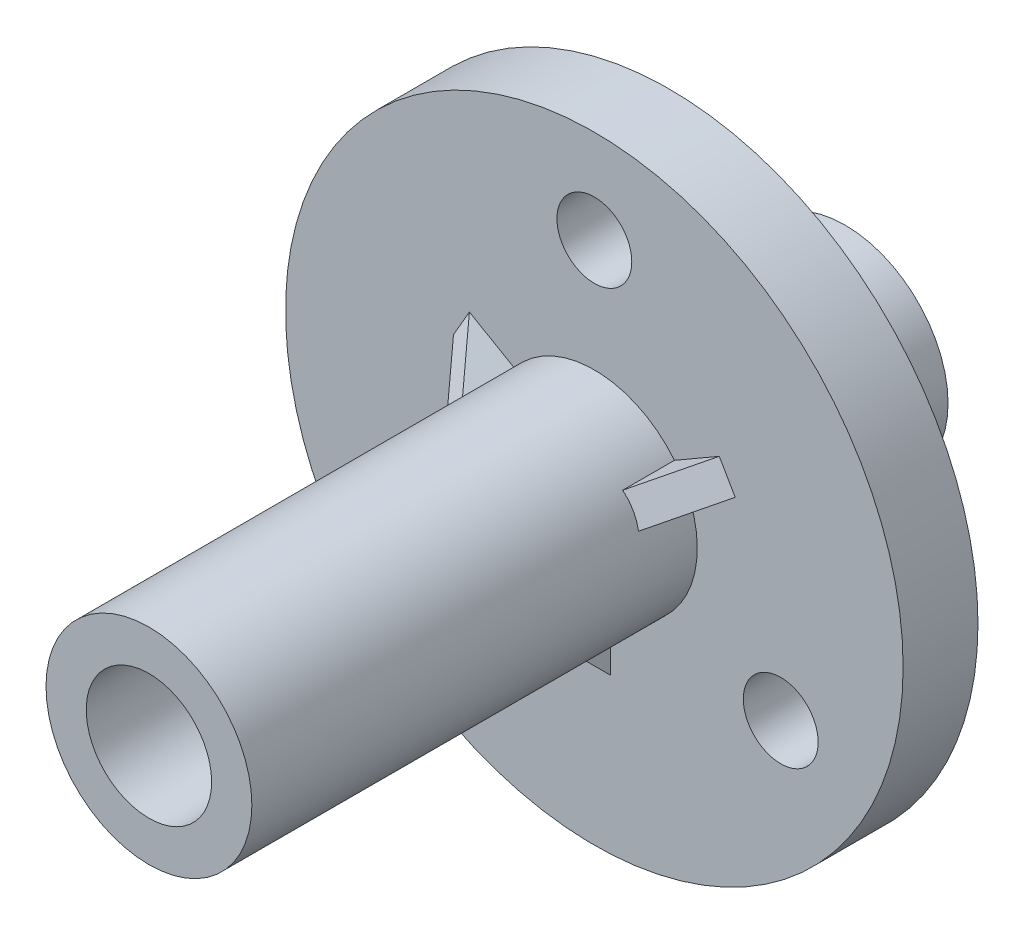
ISO-10303-21;
HEADER;
FILE_DESCRIPTION(('STEP AP214'),'2;1');
FILE_NAME('part.step','',(''),(''),'','','');
FILE_SCHEMA(('AUTOMOTIVE_DESIGN { 1 0 10303 214 1 1 1 1 }'));
ENDSEC;
DATA;
#1=APPLICATION_CONTEXT('core data for automotive mechanical design processes');
#2=APPLICATION_PROTOCOL_DEFINITION('international standard','automotive_design',2000,#1);
#3=PRODUCT_CONTEXT('',#1,'mechanical');
#4=PRODUCT('Part','Part','',(#3));
#5=PRODUCT_RELATED_PRODUCT_CATEGORY('part','',(#4));
#6=PRODUCT_DEFINITION_FORMATION('','',#4);
#7=PRODUCT_DEFINITION_CONTEXT('part definition',#1,'design');
#8=PRODUCT_DEFINITION('design','',#6,#7);
#9=PRODUCT_DEFINITION_SHAPE('','',#8);
#10=(LENGTH_UNIT() NAMED_UNIT(*) SI_UNIT(.MILLI.,.METRE.));
#11=(NAMED_UNIT(*) PLANE_ANGLE_UNIT() SI_UNIT($,.RADIAN.));
#12=(NAMED_UNIT(*) SI_UNIT($,.STERADIAN.) SOLID_ANGLE_UNIT());
#13=UNCERTAINTY_MEASURE_WITH_UNIT(LENGTH_MEASURE(1.E-05),#10,'distance_accuracy_value','');
#14=(GEOMETRIC_REPRESENTATION_CONTEXT(3) GLOBAL_UNCERTAINTY_ASSIGNED_CONTEXT((#13)) GLOBAL_UNIT_ASSIGNED_CONTEXT((#10,
#11,#12)) REPRESENTATION_CONTEXT('',''));
#15=CARTESIAN_POINT('',(0.,0.,0.));
#16=DIRECTION('',(0.,0.,1.));
#17=DIRECTION('',(1.,0.,0.));
#18=AXIS2_PLACEMENT_3D('',#15,#16,#17);
#19=CARTESIAN_POINT('',(0.,0.,0.));
#20=DIRECTION('',(0.,0.,1.));
#21=DIRECTION('',(1.,0.,0.));
#22=AXIS2_PLACEMENT_3D('',#19,#20,#21);
#23=PLANE('',#22);
#24=CARTESIAN_POINT('',(9.95929214352106,-5.74999999999997,0.));
#25=DIRECTION('',(0.,0.,1.));
#26=DIRECTION('',(1.,0.,0.));
#27=AXIS2_PLACEMENT_3D('',#24,#25,#26);
#28=CIRCLE('',#27,2.);
#29=CARTESIAN_POINT('',(11.9592921435211,-5.74999999999997,0.));
#30=VERTEX_POINT('',#29);
#31=EDGE_CURVE('E297',#30,#30,#28,.T.);
#32=ORIENTED_EDGE('',*,*,#31,.T.);
#33=EDGE_LOOP('',(#32));
#34=FACE_BOUND('',#33,.T.);
#35=CARTESIAN_POINT('',(-9.95929214352106,-5.74999999999998,0.));
#36=DIRECTION('',(0.,0.,1.));
#37=DIRECTION('',(1.,0.,0.));
#38=AXIS2_PLACEMENT_3D('',#35,#36,#37);
#39=CIRCLE('',#38,2.);
#40=CARTESIAN_POINT('',(-7.95929214352106,-5.74999999999998,0.));
#41=VERTEX_POINT('',#40);
#42=EDGE_CURVE('E307',#41,#41,#39,.T.);
#43=ORIENTED_EDGE('',*,*,#42,.T.);
#44=EDGE_LOOP('',(#43));
#45=FACE_BOUND('',#44,.T.);
#46=CARTESIAN_POINT('',(0.,11.5,0.));
#47=DIRECTION('',(0.,0.,1.));
#48=DIRECTION('',(1.,0.,0.));
#49=AXIS2_PLACEMENT_3D('',#46,#47,#48);
#50=CIRCLE('',#49,2.);
#51=CARTESIAN_POINT('',(2.,11.5,0.));
#52=VERTEX_POINT('',#51);
#53=EDGE_CURVE('E315',#52,#52,#50,.T.);
#54=ORIENTED_EDGE('',*,*,#53,.T.);
#55=EDGE_LOOP('',(#54));
#56=FACE_BOUND('',#55,.T.);
#57=CARTESIAN_POINT('',(0.,0.,0.));
#58=DIRECTION('',(0.,0.,1.));
#59=DIRECTION('',(1.,0.,0.));
#60=AXIS2_PLACEMENT_3D('',#57,#58,#59);
#61=CIRCLE('',#60,16.5);
#62=CARTESIAN_POINT('',(16.5,0.,0.));
#63=VERTEX_POINT('',#62);
#64=EDGE_CURVE('E323',#63,#63,#61,.T.);
#65=ORIENTED_EDGE('',*,*,#64,.F.);
#66=EDGE_LOOP('',(#65));
#67=FACE_BOUND('',#66,.T.);
#68=DIRECTION('',(-0.866025403784443,0.499999999999992,0.));
#69=VECTOR('',#68,1.);
#70=CARTESIAN_POINT('',(0.424999999999993,0.736121593216777,0.));
#71=LINE('',#70,#69);
#72=CARTESIAN_POINT('',(-4.28091383261533,3.45308221126036,0.));
#73=VERTEX_POINT('',#72);
#74=CARTESIAN_POINT('',(-6.67640831103244,4.83612159321671,0.));
#75=VERTEX_POINT('',#74);
#76=EDGE_CURVE('E180',#73,#75,#71,.T.);
#77=ORIENTED_EDGE('',*,*,#76,.T.);
#78=DIRECTION('',(-0.499999999999992,-0.866025403784443,0.));
#79=VECTOR('',#78,1.);
#80=CARTESIAN_POINT('',(-6.67640831103244,4.83612159321671,0.));
#81=LINE('',#80,#79);
#82=CARTESIAN_POINT('',(-7.52640831103243,3.36387840678316,0.));
#83=VERTEX_POINT('',#82);
#84=EDGE_CURVE('E176',#75,#83,#81,.T.);
#85=ORIENTED_EDGE('',*,*,#84,.T.);
#86=DIRECTION('',(-0.866025403784443,0.499999999999992,0.));
#87=VECTOR('',#86,1.);
#88=CARTESIAN_POINT('',(-0.424999999999993,-0.736121593216777,0.));
#89=LINE('',#88,#87);
#90=CARTESIAN_POINT('',(-5.13091383261531,1.9808390248268,0.));
#91=VERTEX_POINT('',#90);
#92=EDGE_CURVE('E163',#91,#83,#89,.T.);
#93=ORIENTED_EDGE('',*,*,#92,.F.);
#94=CARTESIAN_POINT('',(0.,0.,0.));
#95=DIRECTION('',(0.,0.,1.));
#96=DIRECTION('',(1.,0.,0.));
#97=AXIS2_PLACEMENT_3D('',#94,#95,#96);
#98=CIRCLE('',#97,5.5);
#99=CARTESIAN_POINT('',(-0.85,-5.43392123608725,0.));
#100=VERTEX_POINT('',#99);
#101=EDGE_CURVE('E335',#100,#91,#98,.F.);
#102=ORIENTED_EDGE('',*,*,#101,.F.);
#103=DIRECTION('',(0.,-1.,0.));
#104=VECTOR('',#103,1.);
#105=CARTESIAN_POINT('',(-0.85,0.,0.));
#106=LINE('',#105,#104);
#107=CARTESIAN_POINT('',(-0.85,-8.2,0.));
#108=VERTEX_POINT('',#107);
#109=EDGE_CURVE('E214',#100,#108,#106,.T.);
#110=ORIENTED_EDGE('',*,*,#109,.T.);
#111=DIRECTION('',(1.,0.,0.));
#112=VECTOR('',#111,1.);
#113=CARTESIAN_POINT('',(-0.85,-8.2,0.));
#114=LINE('',#113,#112);
#115=CARTESIAN_POINT('',(0.85,-8.2,0.));
#116=VERTEX_POINT('',#115);
#117=EDGE_CURVE('E222',#108,#116,#114,.T.);
#118=ORIENTED_EDGE('',*,*,#117,.T.);
#119=DIRECTION('',(0.,-1.,0.));
#120=VECTOR('',#119,1.);
#121=CARTESIAN_POINT('',(0.85,0.,0.));
#122=LINE('',#121,#120);
#123=CARTESIAN_POINT('',(0.85,-5.43392123608725,0.));
#124=VERTEX_POINT('',#123);
#125=EDGE_CURVE('E208',#124,#116,#122,.T.);
#126=ORIENTED_EDGE('',*,*,#125,.F.);
#127=CARTESIAN_POINT('',(5.13091383261529,1.98083902482688,0.));
#128=VERTEX_POINT('',#127);
#129=EDGE_CURVE('E331',#128,#124,#98,.F.);
#130=ORIENTED_EDGE('',*,*,#129,.F.);
#131=DIRECTION('',(0.866025403784436,0.500000000000004,0.));
#132=VECTOR('',#131,1.);
#133=CARTESIAN_POINT('',(0.425000000000003,-0.736121593216771,0.));
#134=LINE('',#133,#132);
#135=CARTESIAN_POINT('',(7.52640831103238,3.36387840678326,0.));
#136=VERTEX_POINT('',#135);
#137=EDGE_CURVE('E196',#128,#136,#134,.T.);
#138=ORIENTED_EDGE('',*,*,#137,.T.);
#139=DIRECTION('',(-0.500000000000004,0.866025403784436,0.));
#140=VECTOR('',#139,1.);
#141=CARTESIAN_POINT('',(7.52640831103238,3.36387840678326,0.));
#142=LINE('',#141,#140);
#143=CARTESIAN_POINT('',(6.67640831103238,4.8361215932168,0.));
#144=VERTEX_POINT('',#143);
#145=EDGE_CURVE('E204',#136,#144,#142,.T.);
#146=ORIENTED_EDGE('',*,*,#145,.T.);
#147=DIRECTION('',(0.866025403784436,0.500000000000004,0.));
#148=VECTOR('',#147,1.);
#149=CARTESIAN_POINT('',(-0.425000000000003,0.736121593216771,0.));
#150=LINE('',#149,#148);
#151=CARTESIAN_POINT('',(4.28091383261528,3.45308221126042,0.));
#152=VERTEX_POINT('',#151);
#153=EDGE_CURVE('E185',#152,#144,#150,.T.);
#154=ORIENTED_EDGE('',*,*,#153,.F.);
#155=EDGE_CURVE('E339',#73,#152,#98,.F.);
#156=ORIENTED_EDGE('',*,*,#155,.F.);
#157=EDGE_LOOP('',(#77,#85,#93,#102,#110,#118,#126,#130,#138,#146,#154,#156));
#158=FACE_BOUND('',#157,.T.);
#159=ADVANCED_FACE('F39',(#34,#45,#56,#67,#158),#23,.F.);
#160=CARTESIAN_POINT('',(0.,0.,-9.4));
#161=DIRECTION('',(0.,0.,1.));
#162=DIRECTION('',(1.,0.,0.));
#163=AXIS2_PLACEMENT_3D('',#160,#161,#162);
#164=CYLINDRICAL_SURFACE('',#163,5.5);
#165=CARTESIAN_POINT('',(0.,0.,-9.4));
#166=DIRECTION('',(0.,0.,-1.));
#167=DIRECTION('',(-1.,0.,0.));
#168=AXIS2_PLACEMENT_3D('',#165,#166,#167);
#169=CIRCLE('',#168,5.5);
#170=CARTESIAN_POINT('',(-5.5,0.,-9.4));
#171=VERTEX_POINT('',#170);
#172=EDGE_CURVE('E288',#171,#171,#169,.T.);
#173=ORIENTED_EDGE('',*,*,#172,.F.);
#174=EDGE_LOOP('',(#173));
#175=FACE_BOUND('',#174,.T.);
#176=DIRECTION('',(0.,0.,1.));
#177=VECTOR('',#176,1.);
#178=CARTESIAN_POINT('',(-4.28091383261533,3.45308221126036,-9.4));
#179=LINE('',#178,#177);
#180=CARTESIAN_POINT('',(-4.28091383261533,3.45308221126036,-2.76607876391275));
#181=VERTEX_POINT('',#180);
#182=EDGE_CURVE('E11',#73,#181,#179,.F.);
#183=ORIENTED_EDGE('',*,*,#182,.F.);
#184=ORIENTED_EDGE('',*,*,#155,.T.);
#185=DIRECTION('',(0.,0.,1.));
#186=VECTOR('',#185,1.);
#187=CARTESIAN_POINT('',(4.28091383261528,3.45308221126042,-9.4));
#188=LINE('',#187,#186);
#189=CARTESIAN_POINT('',(4.28091383261528,3.45308221126042,-2.76607876391275));
#190=VERTEX_POINT('',#189);
#191=EDGE_CURVE('E381',#152,#190,#188,.F.);
#192=ORIENTED_EDGE('',*,*,#191,.T.);
#193=CARTESIAN_POINT('',(0.,0.,-8.2));
#194=DIRECTION('',(0.612372435695793,0.353553390593277,-0.707106781186548));
#195=DIRECTION('',(0.612372435695793,0.353553390593277,0.707106781186547));
#196=AXIS2_PLACEMENT_3D('',#193,#194,#195);
#197=ELLIPSE('',#196,7.77817459305202,5.5);
#198=CARTESIAN_POINT('',(5.13091383261529,1.98083902482688,-2.76607876391275));
#199=VERTEX_POINT('',#198);
#200=EDGE_CURVE('E385',#190,#199,#197,.T.);
#201=ORIENTED_EDGE('',*,*,#200,.T.);
#202=DIRECTION('',(0.,0.,1.));
#203=VECTOR('',#202,1.);
#204=CARTESIAN_POINT('',(5.13091383261529,1.98083902482688,-9.4));
#205=LINE('',#204,#203);
#206=EDGE_CURVE('E389',#128,#199,#205,.F.);
#207=ORIENTED_EDGE('',*,*,#206,.F.);
#208=ORIENTED_EDGE('',*,*,#129,.T.);
#209=DIRECTION('',(0.,0.,1.));
#210=VECTOR('',#209,1.);
#211=CARTESIAN_POINT('',(0.85,-5.43392123608725,-9.4));
#212=LINE('',#211,#210);
#213=CARTESIAN_POINT('',(0.85,-5.43392123608725,-2.76607876391275));
#214=VERTEX_POINT('',#213);
#215=EDGE_CURVE('E370',#124,#214,#212,.F.);
#216=ORIENTED_EDGE('',*,*,#215,.T.);
#217=CARTESIAN_POINT('',(0.,0.,-8.2));
#218=DIRECTION('',(0.,-0.707106781186548,-0.707106781186548));
#219=DIRECTION('',(0.,-0.707106781186548,0.707106781186548));
#220=AXIS2_PLACEMENT_3D('',#217,#218,#219);
#221=ELLIPSE('',#220,7.77817459305202,5.5);
#222=CARTESIAN_POINT('',(-0.85,-5.43392123608725,-2.76607876391275));
#223=VERTEX_POINT('',#222);
#224=EDGE_CURVE('E374',#214,#223,#221,.T.);
#225=ORIENTED_EDGE('',*,*,#224,.T.);
#226=DIRECTION('',(0.,0.,1.));
#227=VECTOR('',#226,1.);
#228=CARTESIAN_POINT('',(-0.85,-5.43392123608725,-9.4));
#229=LINE('',#228,#227);
#230=EDGE_CURVE('E378',#100,#223,#229,.F.);
#231=ORIENTED_EDGE('',*,*,#230,.F.);
#232=ORIENTED_EDGE('',*,*,#101,.T.);
#233=DIRECTION('',(0.,0.,1.));
#234=VECTOR('',#233,1.);
#235=CARTESIAN_POINT('',(-5.13091383261531,1.98083902482681,-9.4));
#236=LINE('',#235,#234);
#237=CARTESIAN_POINT('',(-5.13091383261531,1.98083902482681,-2.76607876391275));
#238=VERTEX_POINT('',#237);
#239=EDGE_CURVE('E166',#91,#238,#236,.F.);
#240=ORIENTED_EDGE('',*,*,#239,.T.);
#241=CARTESIAN_POINT('',(0.,0.,-8.2));
#242=DIRECTION('',(-0.612372435695798,0.353553390593268,-0.707106781186547));
#243=DIRECTION('',(-0.612372435695798,0.353553390593268,0.707106781186548));
#244=AXIS2_PLACEMENT_3D('',#241,#242,#243);
#245=ELLIPSE('',#244,7.77817459305202,5.5);
#246=EDGE_CURVE('E48',#238,#181,#245,.T.);
#247=ORIENTED_EDGE('',*,*,#246,.T.);
#248=EDGE_LOOP('',(#183,#184,#192,#201,#207,#208,#216,#225,#231,#232,#240,#247));
#249=FACE_BOUND('',#248,.T.);
#250=ADVANCED_FACE('F396',(#175,#249),#164,.T.);
#251=CARTESIAN_POINT('',(0.,0.,4.));
#252=DIRECTION('',(0.,0.,1.));
#253=DIRECTION('',(1.,0.,0.));
#254=AXIS2_PLACEMENT_3D('',#251,#252,#253);
#255=PLANE('',#254);
#256=CARTESIAN_POINT('',(-9.95929214352106,-5.74999999999998,4.));
#257=DIRECTION('',(0.,0.,1.));
#258=DIRECTION('',(1.,0.,0.));
#259=AXIS2_PLACEMENT_3D('',#256,#257,#258);
#260=CIRCLE('',#259,2.);
#261=CARTESIAN_POINT('',(-7.95929214352106,-5.74999999999998,4.));
#262=VERTEX_POINT('',#261);
#263=EDGE_CURVE('E311',#262,#262,#260,.T.);
#264=ORIENTED_EDGE('',*,*,#263,.F.);
#265=EDGE_LOOP('',(#264));
#266=FACE_BOUND('',#265,.T.);
#267=CARTESIAN_POINT('',(0.,0.,4.));
#268=DIRECTION('',(0.,0.,1.));
#269=DIRECTION('',(1.,0.,0.));
#270=AXIS2_PLACEMENT_3D('',#267,#268,#269);
#271=CIRCLE('',#270,16.5);
#272=CARTESIAN_POINT('',(16.5,0.,4.));
#273=VERTEX_POINT('',#272);
#274=EDGE_CURVE('E327',#273,#273,#271,.T.);
#275=ORIENTED_EDGE('',*,*,#274,.T.);
#276=EDGE_LOOP('',(#275));
#277=FACE_BOUND('',#276,.T.);
#278=CARTESIAN_POINT('',(0.,11.5,4.));
#279=DIRECTION('',(0.,0.,1.));
#280=DIRECTION('',(1.,0.,0.));
#281=AXIS2_PLACEMENT_3D('',#278,#279,#280);
#282=CIRCLE('',#281,2.);
#283=CARTESIAN_POINT('',(2.,11.5,4.));
#284=VERTEX_POINT('',#283);
#285=EDGE_CURVE('E319',#284,#284,#282,.T.);
#286=ORIENTED_EDGE('',*,*,#285,.F.);
#287=EDGE_LOOP('',(#286));
#288=FACE_BOUND('',#287,.T.);
#289=CARTESIAN_POINT('',(9.95929214352106,-5.74999999999997,4.));
#290=DIRECTION('',(0.,0.,1.));
#291=DIRECTION('',(1.,0.,0.));
#292=AXIS2_PLACEMENT_3D('',#289,#290,#291);
#293=CIRCLE('',#292,2.);
#294=CARTESIAN_POINT('',(11.9592921435211,-5.74999999999997,4.));
#295=VERTEX_POINT('',#294);
#296=EDGE_CURVE('E303',#295,#295,#293,.T.);
#297=ORIENTED_EDGE('',*,*,#296,.F.);
#298=EDGE_LOOP('',(#297));
#299=FACE_BOUND('',#298,.T.);
#300=DIRECTION('',(-0.499999999999992,-0.866025403784443,0.));
#301=VECTOR('',#300,1.);
#302=CARTESIAN_POINT('',(-6.67640831103244,4.83612159321671,4.));
#303=LINE('',#302,#301);
#304=CARTESIAN_POINT('',(-6.67640831103244,4.83612159321671,4.));
#305=VERTEX_POINT('',#304);
#306=CARTESIAN_POINT('',(-7.52640831103243,3.36387840678316,4.));
#307=VERTEX_POINT('',#306);
#308=EDGE_CURVE('E241',#305,#307,#303,.T.);
#309=ORIENTED_EDGE('',*,*,#308,.F.);
#310=DIRECTION('',(-0.866025403784443,0.499999999999992,0.));
#311=VECTOR('',#310,1.);
#312=CARTESIAN_POINT('',(0.424999999999993,0.736121593216777,4.));
#313=LINE('',#312,#311);
#314=CARTESIAN_POINT('',(-4.28091383261533,3.45308221126036,4.));
#315=VERTEX_POINT('',#314);
#316=EDGE_CURVE('E234',#315,#305,#313,.T.);
#317=ORIENTED_EDGE('',*,*,#316,.F.);
#318=CARTESIAN_POINT('',(0.,0.,4.));
#319=DIRECTION('',(0.,0.,1.));
#320=DIRECTION('',(1.,0.,0.));
#321=AXIS2_PLACEMENT_3D('',#318,#319,#320);
#322=CIRCLE('',#321,5.5);
#323=CARTESIAN_POINT('',(4.28091383261528,3.45308221126042,4.));
#324=VERTEX_POINT('',#323);
#325=EDGE_CURVE('E302',#324,#315,#322,.T.);
#326=ORIENTED_EDGE('',*,*,#325,.F.);
#327=DIRECTION('',(0.866025403784436,0.500000000000004,0.));
#328=VECTOR('',#327,1.);
#329=CARTESIAN_POINT('',(-0.425000000000003,0.736121593216771,4.));
#330=LINE('',#329,#328);
#331=CARTESIAN_POINT('',(6.67640831103238,4.8361215932168,4.));
#332=VERTEX_POINT('',#331);
#333=EDGE_CURVE('E244',#324,#332,#330,.T.);
#334=ORIENTED_EDGE('',*,*,#333,.T.);
#335=DIRECTION('',(-0.500000000000004,0.866025403784436,0.));
#336=VECTOR('',#335,1.);
#337=CARTESIAN_POINT('',(7.52640831103238,3.36387840678326,4.));
#338=LINE('',#337,#336);
#339=CARTESIAN_POINT('',(7.52640831103238,3.36387840678326,4.));
#340=VERTEX_POINT('',#339);
#341=EDGE_CURVE('E259',#340,#332,#338,.T.);
#342=ORIENTED_EDGE('',*,*,#341,.F.);
#343=DIRECTION('',(0.866025403784436,0.500000000000004,0.));
#344=VECTOR('',#343,1.);
#345=CARTESIAN_POINT('',(0.425000000000003,-0.736121593216771,4.));
#346=LINE('',#345,#344);
#347=CARTESIAN_POINT('',(5.13091383261529,1.98083902482688,4.));
#348=VERTEX_POINT('',#347);
#349=EDGE_CURVE('E252',#348,#340,#346,.T.);
#350=ORIENTED_EDGE('',*,*,#349,.F.);
#351=CARTESIAN_POINT('',(0.85,-5.43392123608725,4.));
#352=VERTEX_POINT('',#351);
#353=EDGE_CURVE('E298',#352,#348,#322,.T.);
#354=ORIENTED_EDGE('',*,*,#353,.F.);
#355=DIRECTION('',(0.,-1.,0.));
#356=VECTOR('',#355,1.);
#357=CARTESIAN_POINT('',(0.85,0.,4.));
#358=LINE('',#357,#356);
#359=CARTESIAN_POINT('',(0.85,-8.2,4.));
#360=VERTEX_POINT('',#359);
#361=EDGE_CURVE('E262',#352,#360,#358,.T.);
#362=ORIENTED_EDGE('',*,*,#361,.T.);
#363=DIRECTION('',(1.,0.,0.));
#364=VECTOR('',#363,1.);
#365=CARTESIAN_POINT('',(-0.85,-8.2,4.));
#366=LINE('',#365,#364);
#367=CARTESIAN_POINT('',(-0.85,-8.2,4.));
#368=VERTEX_POINT('',#367);
#369=EDGE_CURVE('E277',#368,#360,#366,.T.);
#370=ORIENTED_EDGE('',*,*,#369,.F.);
#371=DIRECTION('',(0.,-1.,0.));
#372=VECTOR('',#371,1.);
#373=CARTESIAN_POINT('',(-0.85,0.,4.));
#374=LINE('',#373,#372);
#375=CARTESIAN_POINT('',(-0.85,-5.43392123608725,4.));
#376=VERTEX_POINT('',#375);
#377=EDGE_CURVE('E270',#376,#368,#374,.T.);
#378=ORIENTED_EDGE('',*,*,#377,.F.);
#379=CARTESIAN_POINT('',(-5.13091383261532,1.98083902482681,4.));
#380=VERTEX_POINT('',#379);
#381=EDGE_CURVE('E292',#380,#376,#322,.T.);
#382=ORIENTED_EDGE('',*,*,#381,.F.);
#383=DIRECTION('',(-0.866025403784443,0.499999999999992,0.));
#384=VECTOR('',#383,1.);
#385=CARTESIAN_POINT('',(-0.424999999999993,-0.736121593216777,4.));
#386=LINE('',#385,#384);
#387=EDGE_CURVE('E226',#380,#307,#386,.T.);
#388=ORIENTED_EDGE('',*,*,#387,.T.);
#389=EDGE_LOOP('',(#309,#317,#326,#334,#342,#350,#354,#362,#370,#378,#382,#388));
#390=FACE_BOUND('',#389,.T.);
#391=ADVANCED_FACE('F434',(#266,#277,#288,#299,#390),#255,.T.);
#392=CARTESIAN_POINT('',(0.,0.,27.8));
#393=DIRECTION('',(0.,0.,-1.));
#394=DIRECTION('',(-1.,0.,0.));
#395=AXIS2_PLACEMENT_3D('',#392,#393,#394);
#396=CYLINDRICAL_SURFACE('',#395,5.5);
#397=CARTESIAN_POINT('',(0.,0.,27.8));
#398=DIRECTION('',(0.,0.,1.));
#399=DIRECTION('',(1.,0.,0.));
#400=AXIS2_PLACEMENT_3D('',#397,#398,#399);
#401=CIRCLE('',#400,5.5);
#402=CARTESIAN_POINT('',(5.5,0.,27.8));
#403=VERTEX_POINT('',#402);
#404=EDGE_CURVE('E293',#403,#403,#401,.T.);
#405=ORIENTED_EDGE('',*,*,#404,.F.);
#406=EDGE_LOOP('',(#405));
#407=FACE_BOUND('',#406,.T.);
#408=DIRECTION('',(0.,0.,-1.));
#409=VECTOR('',#408,1.);
#410=CARTESIAN_POINT('',(-4.28091383261533,3.45308221126036,27.8));
#411=LINE('',#410,#409);
#412=CARTESIAN_POINT('',(-4.28091383261533,3.45308221126036,6.76607876391275));
#413=VERTEX_POINT('',#412);
#414=EDGE_CURVE('E367',#413,#315,#411,.T.);
#415=ORIENTED_EDGE('',*,*,#414,.F.);
#416=CARTESIAN_POINT('',(0.,0.,12.2));
#417=DIRECTION('',(0.612372435695798,-0.353553390593268,-0.707106781186547));
#418=DIRECTION('',(-0.612372435695798,0.353553390593268,-0.707106781186548));
#419=AXIS2_PLACEMENT_3D('',#416,#417,#418);
#420=ELLIPSE('',#419,7.77817459305202,5.5);
#421=CARTESIAN_POINT('',(-5.13091383261531,1.9808390248268,6.76607876391275));
#422=VERTEX_POINT('',#421);
#423=EDGE_CURVE('E364',#422,#413,#420,.T.);
#424=ORIENTED_EDGE('',*,*,#423,.F.);
#425=DIRECTION('',(0.,0.,-1.));
#426=VECTOR('',#425,1.);
#427=CARTESIAN_POINT('',(-5.13091383261531,1.98083902482681,27.8));
#428=LINE('',#427,#426);
#429=EDGE_CURVE('E360',#422,#380,#428,.T.);
#430=ORIENTED_EDGE('',*,*,#429,.T.);
#431=ORIENTED_EDGE('',*,*,#381,.T.);
#432=DIRECTION('',(0.,0.,-1.));
#433=VECTOR('',#432,1.);
#434=CARTESIAN_POINT('',(-0.85,-5.43392123608725,27.8));
#435=LINE('',#434,#433);
#436=CARTESIAN_POINT('',(-0.85,-5.43392123608725,6.76607876391275));
#437=VERTEX_POINT('',#436);
#438=EDGE_CURVE('E346',#437,#376,#435,.T.);
#439=ORIENTED_EDGE('',*,*,#438,.F.);
#440=CARTESIAN_POINT('',(0.,0.,12.2));
#441=DIRECTION('',(0.,0.707106781186548,-0.707106781186548));
#442=DIRECTION('',(0.,-0.707106781186548,-0.707106781186548));
#443=AXIS2_PLACEMENT_3D('',#440,#441,#442);
#444=ELLIPSE('',#443,7.77817459305202,5.5);
#445=CARTESIAN_POINT('',(0.85,-5.43392123608725,6.76607876391275));
#446=VERTEX_POINT('',#445);
#447=EDGE_CURVE('E343',#446,#437,#444,.T.);
#448=ORIENTED_EDGE('',*,*,#447,.F.);
#449=DIRECTION('',(0.,0.,-1.));
#450=VECTOR('',#449,1.);
#451=CARTESIAN_POINT('',(0.85,-5.43392123608725,27.8));
#452=LINE('',#451,#450);
#453=EDGE_CURVE('E338',#446,#352,#452,.T.);
#454=ORIENTED_EDGE('',*,*,#453,.T.);
#455=ORIENTED_EDGE('',*,*,#353,.T.);
#456=DIRECTION('',(0.,0.,-1.));
#457=VECTOR('',#456,1.);
#458=CARTESIAN_POINT('',(5.13091383261529,1.98083902482688,27.8));
#459=LINE('',#458,#457);
#460=CARTESIAN_POINT('',(5.13091383261529,1.98083902482688,6.76607876391275));
#461=VERTEX_POINT('',#460);
#462=EDGE_CURVE('E357',#461,#348,#459,.T.);
#463=ORIENTED_EDGE('',*,*,#462,.F.);
#464=CARTESIAN_POINT('',(0.,0.,12.2));
#465=DIRECTION('',(-0.612372435695793,-0.353553390593277,-0.707106781186548));
#466=DIRECTION('',(0.612372435695793,0.353553390593277,-0.707106781186547));
#467=AXIS2_PLACEMENT_3D('',#464,#465,#466);
#468=ELLIPSE('',#467,7.77817459305202,5.5);
#469=CARTESIAN_POINT('',(4.28091383261528,3.45308221126042,6.76607876391275));
#470=VERTEX_POINT('',#469);
#471=EDGE_CURVE('E354',#470,#461,#468,.T.);
#472=ORIENTED_EDGE('',*,*,#471,.F.);
#473=DIRECTION('',(0.,0.,-1.));
#474=VECTOR('',#473,1.);
#475=CARTESIAN_POINT('',(4.28091383261528,3.45308221126042,27.8));
#476=LINE('',#475,#474);
#477=EDGE_CURVE('E350',#470,#324,#476,.T.);
#478=ORIENTED_EDGE('',*,*,#477,.T.);
#479=ORIENTED_EDGE('',*,*,#325,.T.);
#480=EDGE_LOOP('',(#415,#424,#430,#431,#439,#448,#454,#455,#463,#472,#478,#479));
#481=FACE_BOUND('',#480,.T.);
#482=ADVANCED_FACE('F441',(#407,#481),#396,.T.);
#483=CARTESIAN_POINT('',(0.,0.,4.));
#484=DIRECTION('',(0.,0.,-1.));
#485=DIRECTION('',(-1.,0.,0.));
#486=AXIS2_PLACEMENT_3D('',#483,#484,#485);
#487=CYLINDRICAL_SURFACE('',#486,16.5);
#488=ORIENTED_EDGE('',*,*,#274,.F.);
#489=EDGE_LOOP('',(#488));
#490=FACE_BOUND('',#489,.T.);
#491=ORIENTED_EDGE('',*,*,#64,.T.);
#492=EDGE_LOOP('',(#491));
#493=FACE_BOUND('',#492,.T.);
#494=ADVANCED_FACE('F41',(#490,#493),#487,.T.);
#495=CARTESIAN_POINT('',(0.,11.5,4.));
#496=DIRECTION('',(0.,0.,-1.));
#497=DIRECTION('',(-1.,0.,0.));
#498=AXIS2_PLACEMENT_3D('',#495,#496,#497);
#499=CYLINDRICAL_SURFACE('',#498,2.);
#500=ORIENTED_EDGE('',*,*,#285,.T.);
#501=EDGE_LOOP('',(#500));
#502=FACE_BOUND('',#501,.T.);
#503=ORIENTED_EDGE('',*,*,#53,.F.);
#504=EDGE_LOOP('',(#503));
#505=FACE_BOUND('',#504,.T.);
#506=ADVANCED_FACE('F443',(#502,#505),#499,.F.);
#507=CARTESIAN_POINT('',(-9.95929214352106,-5.74999999999998,4.));
#508=DIRECTION('',(0.,0.,-1.));
#509=DIRECTION('',(-1.,0.,0.));
#510=AXIS2_PLACEMENT_3D('',#507,#508,#509);
#511=CYLINDRICAL_SURFACE('',#510,2.);
#512=ORIENTED_EDGE('',*,*,#263,.T.);
#513=EDGE_LOOP('',(#512));
#514=FACE_BOUND('',#513,.T.);
#515=ORIENTED_EDGE('',*,*,#42,.F.);
#516=EDGE_LOOP('',(#515));
#517=FACE_BOUND('',#516,.T.);
#518=ADVANCED_FACE('F446',(#514,#517),#511,.F.);
#519=CARTESIAN_POINT('',(9.95929214352106,-5.74999999999997,4.));
#520=DIRECTION('',(0.,0.,-1.));
#521=DIRECTION('',(-1.,0.,0.));
#522=AXIS2_PLACEMENT_3D('',#519,#520,#521);
#523=CYLINDRICAL_SURFACE('',#522,2.);
#524=ORIENTED_EDGE('',*,*,#296,.T.);
#525=EDGE_LOOP('',(#524));
#526=FACE_BOUND('',#525,.T.);
#527=ORIENTED_EDGE('',*,*,#31,.F.);
#528=EDGE_LOOP('',(#527));
#529=FACE_BOUND('',#528,.T.);
#530=ADVANCED_FACE('F450',(#526,#529),#523,.F.);
#531=CARTESIAN_POINT('',(0.,0.,27.8));
#532=DIRECTION('',(0.,0.,1.));
#533=DIRECTION('',(1.,0.,0.));
#534=AXIS2_PLACEMENT_3D('',#531,#532,#533);
#535=PLANE('',#534);
#536=CARTESIAN_POINT('',(0.,0.,27.8));
#537=DIRECTION('',(0.,0.,1.));
#538=DIRECTION('',(1.,0.,0.));
#539=AXIS2_PLACEMENT_3D('',#536,#537,#538);
#540=CIRCLE('',#539,3.35);
#541=CARTESIAN_POINT('',(3.35,0.,27.8));
#542=VERTEX_POINT('',#541);
#543=EDGE_CURVE('E280',#542,#542,#540,.T.);
#544=ORIENTED_EDGE('',*,*,#543,.F.);
#545=EDGE_LOOP('',(#544));
#546=FACE_BOUND('',#545,.T.);
#547=ORIENTED_EDGE('',*,*,#404,.T.);
#548=EDGE_LOOP('',(#547));
#549=FACE_BOUND('',#548,.T.);
#550=ADVANCED_FACE('F454',(#546,#549),#535,.T.);
#551=CARTESIAN_POINT('',(0.,0.,-9.4));
#552=DIRECTION('',(0.,0.,-1.));
#553=DIRECTION('',(-1.,0.,0.));
#554=AXIS2_PLACEMENT_3D('',#551,#552,#553);
#555=PLANE('',#554);
#556=CARTESIAN_POINT('',(0.,0.,-9.4));
#557=DIRECTION('',(0.,0.,-1.));
#558=DIRECTION('',(-1.,0.,0.));
#559=AXIS2_PLACEMENT_3D('',#556,#557,#558);
#560=CIRCLE('',#559,3.35);
#561=CARTESIAN_POINT('',(-3.35,0.,-9.4));
#562=VERTEX_POINT('',#561);
#563=EDGE_CURVE('E284',#562,#562,#560,.F.);
#564=ORIENTED_EDGE('',*,*,#563,.T.);
#565=EDGE_LOOP('',(#564));
#566=FACE_BOUND('',#565,.T.);
#567=ORIENTED_EDGE('',*,*,#172,.T.);
#568=EDGE_LOOP('',(#567));
#569=FACE_BOUND('',#568,.T.);
#570=ADVANCED_FACE('F460',(#566,#569),#555,.T.);
#571=CARTESIAN_POINT('',(0.,0.,-18.8752308678997));
#572=DIRECTION('',(0.,0.,1.));
#573=DIRECTION('',(1.,0.,0.));
#574=AXIS2_PLACEMENT_3D('',#571,#572,#573);
#575=CYLINDRICAL_SURFACE('',#574,3.35);
#576=ORIENTED_EDGE('',*,*,#543,.T.);
#577=EDGE_LOOP('',(#576));
#578=FACE_BOUND('',#577,.T.);
#579=ORIENTED_EDGE('',*,*,#563,.F.);
#580=EDGE_LOOP('',(#579));
#581=FACE_BOUND('',#580,.T.);
#582=ADVANCED_FACE('F465',(#578,#581),#575,.F.);
#583=CARTESIAN_POINT('',(-0.85,0.,0.));
#584=DIRECTION('',(1.,0.,0.));
#585=DIRECTION('',(0.,0.,-1.));
#586=AXIS2_PLACEMENT_3D('',#583,#584,#585);
#587=PLANE('',#586);
#588=DIRECTION('',(0.,0.707106781186548,0.707106781186548));
#589=VECTOR('',#588,1.);
#590=CARTESIAN_POINT('',(-0.85,-6.1,6.1));
#591=LINE('',#590,#589);
#592=EDGE_CURVE('E273',#368,#437,#591,.T.);
#593=ORIENTED_EDGE('',*,*,#592,.T.);
#594=ORIENTED_EDGE('',*,*,#438,.T.);
#595=ORIENTED_EDGE('',*,*,#377,.T.);
#596=EDGE_LOOP('',(#593,#594,#595));
#597=FACE_BOUND('',#596,.T.);
#598=ADVANCED_FACE('F469',(#597),#587,.F.);
#599=CARTESIAN_POINT('',(0.85,0.,0.));
#600=DIRECTION('',(1.,0.,0.));
#601=DIRECTION('',(0.,0.,-1.));
#602=AXIS2_PLACEMENT_3D('',#599,#600,#601);
#603=PLANE('',#602);
#604=ORIENTED_EDGE('',*,*,#453,.F.);
#605=DIRECTION('',(0.,0.707106781186548,0.707106781186548));
#606=VECTOR('',#605,1.);
#607=CARTESIAN_POINT('',(0.85,-6.1,6.1));
#608=LINE('',#607,#606);
#609=EDGE_CURVE('E266',#360,#446,#608,.T.);
#610=ORIENTED_EDGE('',*,*,#609,.F.);
#611=ORIENTED_EDGE('',*,*,#361,.F.);
#612=EDGE_LOOP('',(#604,#610,#611));
#613=FACE_BOUND('',#612,.T.);
#614=ADVANCED_FACE('F475',(#613),#603,.T.);
#615=CARTESIAN_POINT('',(-0.85,-6.1,6.1));
#616=DIRECTION('',(0.,0.707106781186548,-0.707106781186548));
#617=DIRECTION('',(0.,0.707106781186548,0.707106781186548));
#618=AXIS2_PLACEMENT_3D('',#615,#616,#617);
#619=PLANE('',#618);
#620=ORIENTED_EDGE('',*,*,#609,.T.);
#621=ORIENTED_EDGE('',*,*,#447,.T.);
#622=ORIENTED_EDGE('',*,*,#592,.F.);
#623=ORIENTED_EDGE('',*,*,#369,.T.);
#624=EDGE_LOOP('',(#620,#621,#622,#623));
#625=FACE_BOUND('',#624,.T.);
#626=ADVANCED_FACE('F471',(#625),#619,.F.);
#627=CARTESIAN_POINT('',(0.425000000000003,-0.736121593216771,0.));
#628=DIRECTION('',(-0.500000000000004,0.866025403784436,0.));
#629=DIRECTION('',(0.,0.,-1.));
#630=AXIS2_PLACEMENT_3D('',#627,#628,#629);
#631=PLANE('',#630);
#632=DIRECTION('',(-0.612372435695793,-0.353553390593277,0.707106781186548));
#633=VECTOR('',#632,1.);
#634=CARTESIAN_POINT('',(5.70775496308507,2.31387840678325,6.1));
#635=LINE('',#634,#633);
#636=EDGE_CURVE('E255',#340,#461,#635,.T.);
#637=ORIENTED_EDGE('',*,*,#636,.T.);
#638=ORIENTED_EDGE('',*,*,#462,.T.);
#639=ORIENTED_EDGE('',*,*,#349,.T.);
#640=EDGE_LOOP('',(#637,#638,#639));
#641=FACE_BOUND('',#640,.T.);
#642=ADVANCED_FACE('F474',(#641),#631,.F.);
#643=CARTESIAN_POINT('',(-0.425000000000003,0.736121593216771,0.));
#644=DIRECTION('',(-0.500000000000004,0.866025403784436,0.));
#645=DIRECTION('',(0.,0.,-1.));
#646=AXIS2_PLACEMENT_3D('',#643,#644,#645);
#647=PLANE('',#646);
#648=ORIENTED_EDGE('',*,*,#477,.F.);
#649=DIRECTION('',(-0.612372435695793,-0.353553390593277,0.707106781186548));
#650=VECTOR('',#649,1.);
#651=CARTESIAN_POINT('',(4.85775496308506,3.7861215932168,6.1));
#652=LINE('',#651,#650);
#653=EDGE_CURVE('E248',#332,#470,#652,.T.);
#654=ORIENTED_EDGE('',*,*,#653,.F.);
#655=ORIENTED_EDGE('',*,*,#333,.F.);
#656=EDGE_LOOP('',(#648,#654,#655));
#657=FACE_BOUND('',#656,.T.);
#658=ADVANCED_FACE('F487',(#657),#647,.T.);
#659=CARTESIAN_POINT('',(5.70775496308507,2.31387840678325,6.1));
#660=DIRECTION('',(-0.612372435695793,-0.353553390593277,-0.707106781186548));
#661=DIRECTION('',(-0.755928946018455,0.,0.654653670707976));
#662=AXIS2_PLACEMENT_3D('',#659,#660,#661);
#663=PLANE('',#662);
#664=ORIENTED_EDGE('',*,*,#653,.T.);
#665=ORIENTED_EDGE('',*,*,#471,.T.);
#666=ORIENTED_EDGE('',*,*,#636,.F.);
#667=ORIENTED_EDGE('',*,*,#341,.T.);
#668=EDGE_LOOP('',(#664,#665,#666,#667));
#669=FACE_BOUND('',#668,.T.);
#670=ADVANCED_FACE('F483',(#669),#663,.F.);
#671=CARTESIAN_POINT('',(0.424999999999993,0.736121593216777,0.));
#672=DIRECTION('',(-0.499999999999992,-0.866025403784443,0.));
#673=DIRECTION('',(0.,0.,-1.));
#674=AXIS2_PLACEMENT_3D('',#671,#672,#673);
#675=PLANE('',#674);
#676=DIRECTION('',(0.612372435695798,-0.353553390593268,0.707106781186548));
#677=VECTOR('',#676,1.);
#678=CARTESIAN_POINT('',(-4.85775496308511,3.78612159321673,6.1));
#679=LINE('',#678,#677);
#680=EDGE_CURVE('E237',#305,#413,#679,.T.);
#681=ORIENTED_EDGE('',*,*,#680,.T.);
#682=ORIENTED_EDGE('',*,*,#414,.T.);
#683=ORIENTED_EDGE('',*,*,#316,.T.);
#684=EDGE_LOOP('',(#681,#682,#683));
#685=FACE_BOUND('',#684,.T.);
#686=ADVANCED_FACE('F486',(#685),#675,.F.);
#687=CARTESIAN_POINT('',(-0.424999999999993,-0.736121593216777,0.));
#688=DIRECTION('',(-0.499999999999992,-0.866025403784443,0.));
#689=DIRECTION('',(0.,0.,-1.));
#690=AXIS2_PLACEMENT_3D('',#687,#688,#689);
#691=PLANE('',#690);
#692=ORIENTED_EDGE('',*,*,#429,.F.);
#693=DIRECTION('',(0.612372435695798,-0.353553390593268,0.707106781186548));
#694=VECTOR('',#693,1.);
#695=CARTESIAN_POINT('',(-5.7077549630851,2.31387840678317,6.1));
#696=LINE('',#695,#694);
#697=EDGE_CURVE('E230',#307,#422,#696,.T.);
#698=ORIENTED_EDGE('',*,*,#697,.F.);
#699=ORIENTED_EDGE('',*,*,#387,.F.);
#700=EDGE_LOOP('',(#692,#698,#699));
#701=FACE_BOUND('',#700,.T.);
#702=ADVANCED_FACE('F498',(#701),#691,.T.);
#703=CARTESIAN_POINT('',(-4.85775496308511,3.78612159321673,6.1));
#704=DIRECTION('',(0.612372435695798,-0.353553390593268,-0.707106781186547));
#705=DIRECTION('',(-0.755928946018453,0.,-0.654653670707979));
#706=AXIS2_PLACEMENT_3D('',#703,#704,#705);
#707=PLANE('',#706);
#708=ORIENTED_EDGE('',*,*,#697,.T.);
#709=ORIENTED_EDGE('',*,*,#423,.T.);
#710=ORIENTED_EDGE('',*,*,#680,.F.);
#711=ORIENTED_EDGE('',*,*,#308,.T.);
#712=EDGE_LOOP('',(#708,#709,#710,#711));
#713=FACE_BOUND('',#712,.T.);
#714=ADVANCED_FACE('F495',(#713),#707,.F.);
#715=CARTESIAN_POINT('',(-0.85,0.,4.));
#716=DIRECTION('',(1.,0.,0.));
#717=DIRECTION('',(0.,0.,1.));
#718=AXIS2_PLACEMENT_3D('',#715,#716,#717);
#719=PLANE('',#718);
#720=ORIENTED_EDGE('',*,*,#109,.F.);
#721=ORIENTED_EDGE('',*,*,#230,.T.);
#722=DIRECTION('',(0.,0.707106781186548,-0.707106781186548));
#723=VECTOR('',#722,1.);
#724=CARTESIAN_POINT('',(-0.85,-6.1,-2.1));
#725=LINE('',#724,#723);
#726=EDGE_CURVE('E218',#108,#223,#725,.T.);
#727=ORIENTED_EDGE('',*,*,#726,.F.);
#728=EDGE_LOOP('',(#720,#721,#727));
#729=FACE_BOUND('',#728,.T.);
#730=ADVANCED_FACE('F401',(#729),#719,.F.);
#731=CARTESIAN_POINT('',(0.85,0.,4.));
#732=DIRECTION('',(1.,0.,0.));
#733=DIRECTION('',(0.,0.,1.));
#734=AXIS2_PLACEMENT_3D('',#731,#732,#733);
#735=PLANE('',#734);
#736=ORIENTED_EDGE('',*,*,#215,.F.);
#737=ORIENTED_EDGE('',*,*,#125,.T.);
#738=DIRECTION('',(0.,0.707106781186548,-0.707106781186548));
#739=VECTOR('',#738,1.);
#740=CARTESIAN_POINT('',(0.85,-6.1,-2.1));
#741=LINE('',#740,#739);
#742=EDGE_CURVE('E211',#116,#214,#741,.T.);
#743=ORIENTED_EDGE('',*,*,#742,.T.);
#744=EDGE_LOOP('',(#736,#737,#743));
#745=FACE_BOUND('',#744,.T.);
#746=ADVANCED_FACE('F410',(#745),#735,.T.);
#747=CARTESIAN_POINT('',(-0.85,-6.1,-2.1));
#748=DIRECTION('',(0.,-0.707106781186548,-0.707106781186548));
#749=DIRECTION('',(0.,0.707106781186548,-0.707106781186548));
#750=AXIS2_PLACEMENT_3D('',#747,#748,#749);
#751=PLANE('',#750);
#752=ORIENTED_EDGE('',*,*,#224,.F.);
#753=ORIENTED_EDGE('',*,*,#742,.F.);
#754=ORIENTED_EDGE('',*,*,#117,.F.);
#755=ORIENTED_EDGE('',*,*,#726,.T.);
#756=EDGE_LOOP('',(#752,#753,#754,#755));
#757=FACE_BOUND('',#756,.T.);
#758=ADVANCED_FACE('F404',(#757),#751,.T.);
#759=CARTESIAN_POINT('',(0.425000000000003,-0.736121593216771,4.));
#760=DIRECTION('',(-0.500000000000004,0.866025403784436,0.));
#761=DIRECTION('',(0.,0.,1.));
#762=AXIS2_PLACEMENT_3D('',#759,#760,#761);
#763=PLANE('',#762);
#764=ORIENTED_EDGE('',*,*,#137,.F.);
#765=ORIENTED_EDGE('',*,*,#206,.T.);
#766=DIRECTION('',(-0.612372435695793,-0.353553390593277,-0.707106781186548));
#767=VECTOR('',#766,1.);
#768=CARTESIAN_POINT('',(5.70775496308507,2.31387840678325,-2.1));
#769=LINE('',#768,#767);
#770=EDGE_CURVE('E200',#136,#199,#769,.T.);
#771=ORIENTED_EDGE('',*,*,#770,.F.);
#772=EDGE_LOOP('',(#764,#765,#771));
#773=FACE_BOUND('',#772,.T.);
#774=ADVANCED_FACE('F419',(#773),#763,.F.);
#775=CARTESIAN_POINT('',(-0.425000000000003,0.736121593216771,4.));
#776=DIRECTION('',(-0.500000000000004,0.866025403784436,0.));
#777=DIRECTION('',(0.,0.,1.));
#778=AXIS2_PLACEMENT_3D('',#775,#776,#777);
#779=PLANE('',#778);
#780=ORIENTED_EDGE('',*,*,#191,.F.);
#781=ORIENTED_EDGE('',*,*,#153,.T.);
#782=DIRECTION('',(-0.612372435695793,-0.353553390593277,-0.707106781186548));
#783=VECTOR('',#782,1.);
#784=CARTESIAN_POINT('',(4.85775496308506,3.7861215932168,-2.1));
#785=LINE('',#784,#783);
#786=EDGE_CURVE('E63',#144,#190,#785,.T.);
#787=ORIENTED_EDGE('',*,*,#786,.T.);
#788=EDGE_LOOP('',(#780,#781,#787));
#789=FACE_BOUND('',#788,.T.);
#790=ADVANCED_FACE('F414',(#789),#779,.T.);
#791=CARTESIAN_POINT('',(5.70775496308507,2.31387840678325,-2.1));
#792=DIRECTION('',(0.612372435695793,0.353553390593277,-0.707106781186548));
#793=DIRECTION('',(-0.755928946018455,0.,-0.654653670707976));
#794=AXIS2_PLACEMENT_3D('',#791,#792,#793);
#795=PLANE('',#794);
#796=ORIENTED_EDGE('',*,*,#200,.F.);
#797=ORIENTED_EDGE('',*,*,#786,.F.);
#798=ORIENTED_EDGE('',*,*,#145,.F.);
#799=ORIENTED_EDGE('',*,*,#770,.T.);
#800=EDGE_LOOP('',(#796,#797,#798,#799));
#801=FACE_BOUND('',#800,.T.);
#802=ADVANCED_FACE('F417',(#801),#795,.T.);
#803=CARTESIAN_POINT('',(0.424999999999993,0.736121593216777,4.));
#804=DIRECTION('',(-0.499999999999992,-0.866025403784443,0.));
#805=DIRECTION('',(0.,0.,1.));
#806=AXIS2_PLACEMENT_3D('',#803,#804,#805);
#807=PLANE('',#806);
#808=ORIENTED_EDGE('',*,*,#76,.F.);
#809=ORIENTED_EDGE('',*,*,#182,.T.);
#810=DIRECTION('',(0.612372435695798,-0.353553390593268,-0.707106781186548));
#811=VECTOR('',#810,1.);
#812=CARTESIAN_POINT('',(-4.85775496308511,3.78612159321673,-2.1));
#813=LINE('',#812,#811);
#814=EDGE_CURVE('E186',#75,#181,#813,.T.);
#815=ORIENTED_EDGE('',*,*,#814,.F.);
#816=EDGE_LOOP('',(#808,#809,#815));
#817=FACE_BOUND('',#816,.T.);
#818=ADVANCED_FACE('F510',(#817),#807,.F.);
#819=CARTESIAN_POINT('',(-0.424999999999993,-0.736121593216777,4.));
#820=DIRECTION('',(-0.499999999999992,-0.866025403784443,0.));
#821=DIRECTION('',(0.,0.,1.));
#822=AXIS2_PLACEMENT_3D('',#819,#820,#821);
#823=PLANE('',#822);
#824=ORIENTED_EDGE('',*,*,#239,.F.);
#825=ORIENTED_EDGE('',*,*,#92,.T.);
#826=DIRECTION('',(0.612372435695798,-0.353553390593268,-0.707106781186548));
#827=VECTOR('',#826,1.);
#828=CARTESIAN_POINT('',(-5.7077549630851,2.31387840678317,-2.1));
#829=LINE('',#828,#827);
#830=EDGE_CURVE('E55',#83,#238,#829,.T.);
#831=ORIENTED_EDGE('',*,*,#830,.T.);
#832=EDGE_LOOP('',(#824,#825,#831));
#833=FACE_BOUND('',#832,.T.);
#834=ADVANCED_FACE('F164',(#833),#823,.T.);
#835=CARTESIAN_POINT('',(-4.85775496308511,3.78612159321673,-2.1));
#836=DIRECTION('',(-0.612372435695798,0.353553390593268,-0.707106781186547));
#837=DIRECTION('',(-0.755928946018453,0.,0.654653670707979));
#838=AXIS2_PLACEMENT_3D('',#835,#836,#837);
#839=PLANE('',#838);
#840=ORIENTED_EDGE('',*,*,#246,.F.);
#841=ORIENTED_EDGE('',*,*,#830,.F.);
#842=ORIENTED_EDGE('',*,*,#84,.F.);
#843=ORIENTED_EDGE('',*,*,#814,.T.);
#844=EDGE_LOOP('',(#840,#841,#842,#843));
#845=FACE_BOUND('',#844,.T.);
#846=ADVANCED_FACE('F174',(#845),#839,.T.);
#847=CLOSED_SHELL('',(#159,#250,#391,#482,#494,#506,#518,#530,#550,#570,#582,#598,#614,#626,
#642,#658,#670,#686,#702,#714,#730,#746,#758,#774,#790,#802,#818,#834,#846));
#848=MANIFOLD_SOLID_BREP('B2',#847);
#849=ADVANCED_BREP_SHAPE_REPRESENTATION('',(#18,#848),#14);
#850=SHAPE_DEFINITION_REPRESENTATION(#9,#849);
ENDSEC;
END-ISO-10303-21;
